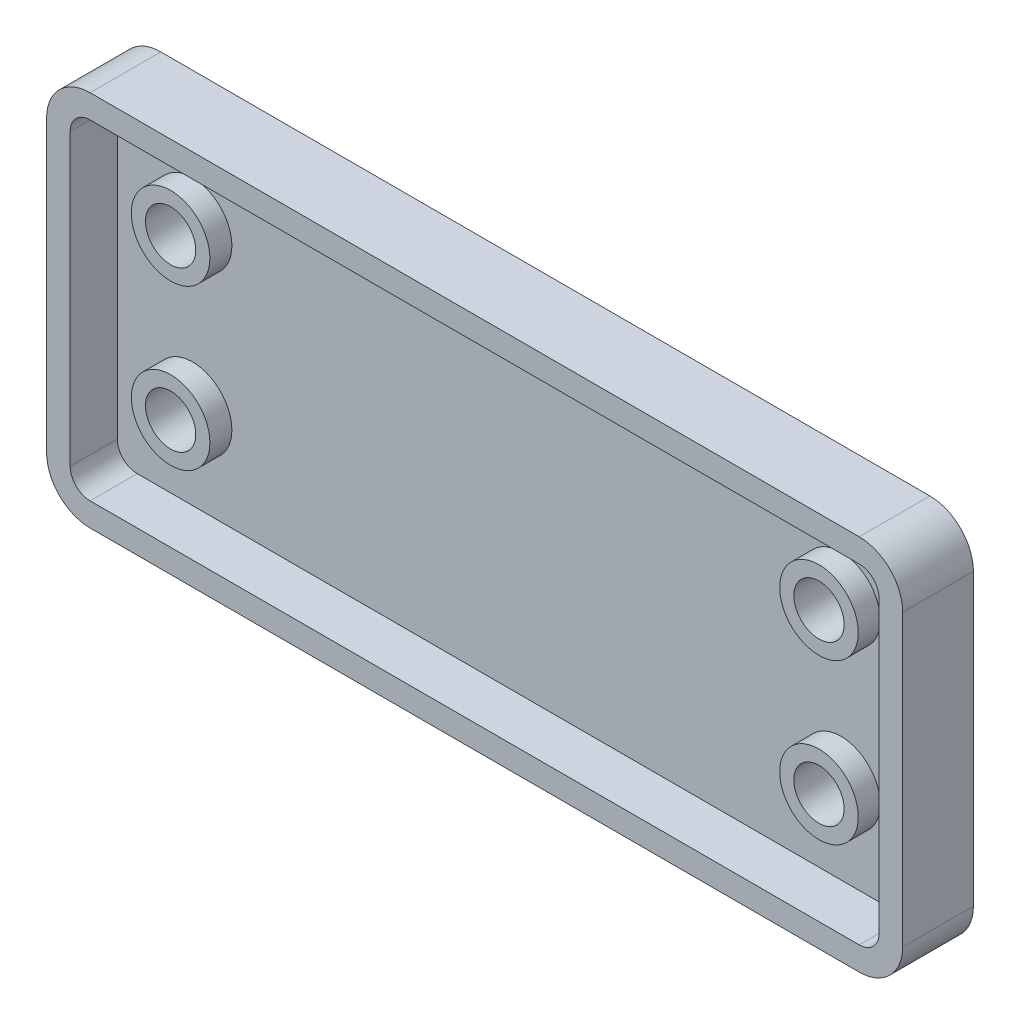
ISO-10303-21;
HEADER;
FILE_DESCRIPTION(('STEP AP214'),'2;1');
FILE_NAME('part.step','',(''),(''),'','','');
FILE_SCHEMA(('AUTOMOTIVE_DESIGN { 1 0 10303 214 1 1 1 1 }'));
ENDSEC;
DATA;
#1=APPLICATION_CONTEXT('core data for automotive mechanical design processes');
#2=APPLICATION_PROTOCOL_DEFINITION('international standard','automotive_design',2000,#1);
#3=PRODUCT_CONTEXT('',#1,'mechanical');
#4=PRODUCT('Part','Part','',(#3));
#5=PRODUCT_RELATED_PRODUCT_CATEGORY('part','',(#4));
#6=PRODUCT_DEFINITION_FORMATION('','',#4);
#7=PRODUCT_DEFINITION_CONTEXT('part definition',#1,'design');
#8=PRODUCT_DEFINITION('design','',#6,#7);
#9=PRODUCT_DEFINITION_SHAPE('','',#8);
#10=(LENGTH_UNIT() NAMED_UNIT(*) SI_UNIT(.MILLI.,.METRE.));
#11=(NAMED_UNIT(*) PLANE_ANGLE_UNIT() SI_UNIT($,.RADIAN.));
#12=(NAMED_UNIT(*) SI_UNIT($,.STERADIAN.) SOLID_ANGLE_UNIT());
#13=UNCERTAINTY_MEASURE_WITH_UNIT(LENGTH_MEASURE(1.E-05),#10,'distance_accuracy_value','');
#14=(GEOMETRIC_REPRESENTATION_CONTEXT(3) GLOBAL_UNCERTAINTY_ASSIGNED_CONTEXT((#13)) GLOBAL_UNIT_ASSIGNED_CONTEXT((#10,
#11,#12)) REPRESENTATION_CONTEXT('',''));
#15=CARTESIAN_POINT('',(0.,0.,0.));
#16=DIRECTION('',(0.,0.,1.));
#17=DIRECTION('',(1.,0.,0.));
#18=AXIS2_PLACEMENT_3D('',#15,#16,#17);
#19=CARTESIAN_POINT('',(24.48,-9.23,3.));
#20=DIRECTION('',(0.,0.,-1.));
#21=DIRECTION('',(-1.,0.,0.));
#22=AXIS2_PLACEMENT_3D('',#19,#20,#21);
#23=CYLINDRICAL_SURFACE('',#22,2.77);
#24=CARTESIAN_POINT('',(24.48,-9.23,-1.5));
#25=DIRECTION('',(0.,0.,1.));
#26=DIRECTION('',(1.,0.,0.));
#27=AXIS2_PLACEMENT_3D('',#24,#25,#26);
#28=CIRCLE('',#27,2.77);
#29=CARTESIAN_POINT('',(24.48,-12.,-1.5));
#30=VERTEX_POINT('',#29);
#31=CARTESIAN_POINT('',(27.25,-9.23,-1.5));
#32=VERTEX_POINT('',#31);
#33=EDGE_CURVE('E170',#30,#32,#28,.T.);
#34=ORIENTED_EDGE('',*,*,#33,.T.);
#35=DIRECTION('',(0.,0.,1.));
#36=VECTOR('',#35,1.);
#37=CARTESIAN_POINT('',(27.25,-9.23,3.));
#38=LINE('',#37,#36);
#39=CARTESIAN_POINT('',(27.25,-9.23,3.));
#40=VERTEX_POINT('',#39);
#41=EDGE_CURVE('E11',#40,#32,#38,.F.);
#42=ORIENTED_EDGE('',*,*,#41,.F.);
#43=CARTESIAN_POINT('',(24.48,-9.23,3.));
#44=DIRECTION('',(0.,0.,1.));
#45=DIRECTION('',(1.,0.,0.));
#46=AXIS2_PLACEMENT_3D('',#43,#44,#45);
#47=CIRCLE('',#46,2.77);
#48=CARTESIAN_POINT('',(24.48,-12.,3.));
#49=VERTEX_POINT('',#48);
#50=EDGE_CURVE('E257',#49,#40,#47,.T.);
#51=ORIENTED_EDGE('',*,*,#50,.F.);
#52=DIRECTION('',(0.,0.,-1.));
#53=VECTOR('',#52,1.);
#54=CARTESIAN_POINT('',(24.48,-12.,3.));
#55=LINE('',#54,#53);
#56=EDGE_CURVE('E224',#49,#30,#55,.T.);
#57=ORIENTED_EDGE('',*,*,#56,.T.);
#58=EDGE_LOOP('',(#34,#42,#51,#57));
#59=FACE_BOUND('',#58,.T.);
#60=ADVANCED_FACE('F34',(#59),#23,.T.);
#61=CARTESIAN_POINT('',(27.25,-9.23,3.));
#62=DIRECTION('',(-1.,0.,0.));
#63=DIRECTION('',(0.,-1.,0.));
#64=AXIS2_PLACEMENT_3D('',#61,#62,#63);
#65=PLANE('',#64);
#66=DIRECTION('',(0.,1.,0.));
#67=VECTOR('',#66,1.);
#68=CARTESIAN_POINT('',(27.25,-9.23,-1.5));
#69=LINE('',#68,#67);
#70=CARTESIAN_POINT('',(27.25,9.23,-1.5));
#71=VERTEX_POINT('',#70);
#72=EDGE_CURVE('E222',#32,#71,#69,.T.);
#73=ORIENTED_EDGE('',*,*,#72,.T.);
#74=DIRECTION('',(0.,0.,-1.));
#75=VECTOR('',#74,1.);
#76=CARTESIAN_POINT('',(27.25,9.23,3.));
#77=LINE('',#76,#75);
#78=CARTESIAN_POINT('',(27.25,9.23,3.));
#79=VERTEX_POINT('',#78);
#80=EDGE_CURVE('E43',#79,#71,#77,.T.);
#81=ORIENTED_EDGE('',*,*,#80,.F.);
#82=DIRECTION('',(0.,1.,0.));
#83=VECTOR('',#82,1.);
#84=CARTESIAN_POINT('',(27.25,-9.23,3.));
#85=LINE('',#84,#83);
#86=EDGE_CURVE('E259',#40,#79,#85,.T.);
#87=ORIENTED_EDGE('',*,*,#86,.F.);
#88=ORIENTED_EDGE('',*,*,#41,.T.);
#89=EDGE_LOOP('',(#73,#81,#87,#88));
#90=FACE_BOUND('',#89,.T.);
#91=ADVANCED_FACE('F287',(#90),#65,.F.);
#92=CARTESIAN_POINT('',(24.48,9.23,3.));
#93=DIRECTION('',(0.,0.,-1.));
#94=DIRECTION('',(-1.,0.,0.));
#95=AXIS2_PLACEMENT_3D('',#92,#93,#94);
#96=CYLINDRICAL_SURFACE('',#95,2.77);
#97=CARTESIAN_POINT('',(24.48,9.23,-1.5));
#98=DIRECTION('',(0.,0.,1.));
#99=DIRECTION('',(1.,0.,0.));
#100=AXIS2_PLACEMENT_3D('',#97,#98,#99);
#101=CIRCLE('',#100,2.77);
#102=CARTESIAN_POINT('',(24.48,12.,-1.5));
#103=VERTEX_POINT('',#102);
#104=EDGE_CURVE('E229',#71,#103,#101,.T.);
#105=ORIENTED_EDGE('',*,*,#104,.T.);
#106=DIRECTION('',(0.,0.,-1.));
#107=VECTOR('',#106,1.);
#108=CARTESIAN_POINT('',(24.48,12.,3.));
#109=LINE('',#108,#107);
#110=CARTESIAN_POINT('',(24.48,12.,3.));
#111=VERTEX_POINT('',#110);
#112=EDGE_CURVE('E232',#111,#103,#109,.T.);
#113=ORIENTED_EDGE('',*,*,#112,.F.);
#114=CARTESIAN_POINT('',(24.48,9.23,3.));
#115=DIRECTION('',(0.,0.,1.));
#116=DIRECTION('',(1.,0.,0.));
#117=AXIS2_PLACEMENT_3D('',#114,#115,#116);
#118=CIRCLE('',#117,2.77);
#119=EDGE_CURVE('E261',#79,#111,#118,.T.);
#120=ORIENTED_EDGE('',*,*,#119,.F.);
#121=ORIENTED_EDGE('',*,*,#80,.T.);
#122=EDGE_LOOP('',(#105,#113,#120,#121));
#123=FACE_BOUND('',#122,.T.);
#124=ADVANCED_FACE('F290',(#123),#96,.T.);
#125=CARTESIAN_POINT('',(-24.48,12.,3.));
#126=DIRECTION('',(0.,-1.,0.));
#127=DIRECTION('',(0.,0.,-1.));
#128=AXIS2_PLACEMENT_3D('',#125,#126,#127);
#129=PLANE('',#128);
#130=DIRECTION('',(-1.,0.,0.));
#131=VECTOR('',#130,1.);
#132=CARTESIAN_POINT('',(-24.48,12.,-1.5));
#133=LINE('',#132,#131);
#134=CARTESIAN_POINT('',(-24.48,12.,-1.5));
#135=VERTEX_POINT('',#134);
#136=EDGE_CURVE('E234',#103,#135,#133,.T.);
#137=ORIENTED_EDGE('',*,*,#136,.T.);
#138=DIRECTION('',(0.,0.,-1.));
#139=VECTOR('',#138,1.);
#140=CARTESIAN_POINT('',(-24.48,12.,3.));
#141=LINE('',#140,#139);
#142=CARTESIAN_POINT('',(-24.48,12.,3.));
#143=VERTEX_POINT('',#142);
#144=EDGE_CURVE('E237',#143,#135,#141,.T.);
#145=ORIENTED_EDGE('',*,*,#144,.F.);
#146=DIRECTION('',(-1.,0.,0.));
#147=VECTOR('',#146,1.);
#148=CARTESIAN_POINT('',(-24.48,12.,3.));
#149=LINE('',#148,#147);
#150=EDGE_CURVE('E263',#111,#143,#149,.T.);
#151=ORIENTED_EDGE('',*,*,#150,.F.);
#152=ORIENTED_EDGE('',*,*,#112,.T.);
#153=EDGE_LOOP('',(#137,#145,#151,#152));
#154=FACE_BOUND('',#153,.T.);
#155=ADVANCED_FACE('F295',(#154),#129,.F.);
#156=CARTESIAN_POINT('',(-24.48,9.23,3.));
#157=DIRECTION('',(0.,0.,-1.));
#158=DIRECTION('',(-1.,0.,0.));
#159=AXIS2_PLACEMENT_3D('',#156,#157,#158);
#160=CYLINDRICAL_SURFACE('',#159,2.77);
#161=CARTESIAN_POINT('',(-24.48,9.23,-1.5));
#162=DIRECTION('',(0.,0.,1.));
#163=DIRECTION('',(1.,0.,0.));
#164=AXIS2_PLACEMENT_3D('',#161,#162,#163);
#165=CIRCLE('',#164,2.77);
#166=CARTESIAN_POINT('',(-27.25,9.23,-1.5));
#167=VERTEX_POINT('',#166);
#168=EDGE_CURVE('E239',#135,#167,#165,.T.);
#169=ORIENTED_EDGE('',*,*,#168,.T.);
#170=DIRECTION('',(0.,0.,-1.));
#171=VECTOR('',#170,1.);
#172=CARTESIAN_POINT('',(-27.25,9.23,3.));
#173=LINE('',#172,#171);
#174=CARTESIAN_POINT('',(-27.25,9.23,3.));
#175=VERTEX_POINT('',#174);
#176=EDGE_CURVE('E242',#175,#167,#173,.T.);
#177=ORIENTED_EDGE('',*,*,#176,.F.);
#178=CARTESIAN_POINT('',(-24.48,9.23,3.));
#179=DIRECTION('',(0.,0.,1.));
#180=DIRECTION('',(1.,0.,0.));
#181=AXIS2_PLACEMENT_3D('',#178,#179,#180);
#182=CIRCLE('',#181,2.77);
#183=EDGE_CURVE('E265',#143,#175,#182,.T.);
#184=ORIENTED_EDGE('',*,*,#183,.F.);
#185=ORIENTED_EDGE('',*,*,#144,.T.);
#186=EDGE_LOOP('',(#169,#177,#184,#185));
#187=FACE_BOUND('',#186,.T.);
#188=ADVANCED_FACE('F299',(#187),#160,.T.);
#189=CARTESIAN_POINT('',(-27.25,-9.23,3.));
#190=DIRECTION('',(1.,0.,0.));
#191=DIRECTION('',(0.,0.,-1.));
#192=AXIS2_PLACEMENT_3D('',#189,#190,#191);
#193=PLANE('',#192);
#194=DIRECTION('',(0.,-1.,0.));
#195=VECTOR('',#194,1.);
#196=CARTESIAN_POINT('',(-27.25,-9.23,-1.5));
#197=LINE('',#196,#195);
#198=CARTESIAN_POINT('',(-27.25,-9.23,-1.5));
#199=VERTEX_POINT('',#198);
#200=EDGE_CURVE('E244',#167,#199,#197,.T.);
#201=ORIENTED_EDGE('',*,*,#200,.T.);
#202=DIRECTION('',(0.,0.,-1.));
#203=VECTOR('',#202,1.);
#204=CARTESIAN_POINT('',(-27.25,-9.23,3.));
#205=LINE('',#204,#203);
#206=CARTESIAN_POINT('',(-27.25,-9.23,3.));
#207=VERTEX_POINT('',#206);
#208=EDGE_CURVE('E247',#207,#199,#205,.T.);
#209=ORIENTED_EDGE('',*,*,#208,.F.);
#210=DIRECTION('',(0.,-1.,0.));
#211=VECTOR('',#210,1.);
#212=CARTESIAN_POINT('',(-27.25,-9.23,3.));
#213=LINE('',#212,#211);
#214=EDGE_CURVE('E267',#175,#207,#213,.T.);
#215=ORIENTED_EDGE('',*,*,#214,.F.);
#216=ORIENTED_EDGE('',*,*,#176,.T.);
#217=EDGE_LOOP('',(#201,#209,#215,#216));
#218=FACE_BOUND('',#217,.T.);
#219=ADVANCED_FACE('F303',(#218),#193,.F.);
#220=CARTESIAN_POINT('',(-24.48,-9.23,3.));
#221=DIRECTION('',(0.,0.,-1.));
#222=DIRECTION('',(-1.,0.,0.));
#223=AXIS2_PLACEMENT_3D('',#220,#221,#222);
#224=CYLINDRICAL_SURFACE('',#223,2.77);
#225=CARTESIAN_POINT('',(-24.48,-9.23,-1.5));
#226=DIRECTION('',(0.,0.,1.));
#227=DIRECTION('',(1.,0.,0.));
#228=AXIS2_PLACEMENT_3D('',#225,#226,#227);
#229=CIRCLE('',#228,2.77);
#230=CARTESIAN_POINT('',(-24.48,-12.,-1.5));
#231=VERTEX_POINT('',#230);
#232=EDGE_CURVE('E249',#199,#231,#229,.T.);
#233=ORIENTED_EDGE('',*,*,#232,.T.);
#234=DIRECTION('',(0.,0.,1.));
#235=VECTOR('',#234,1.);
#236=CARTESIAN_POINT('',(-24.48,-12.,3.));
#237=LINE('',#236,#235);
#238=CARTESIAN_POINT('',(-24.48,-12.,3.));
#239=VERTEX_POINT('',#238);
#240=EDGE_CURVE('E227',#239,#231,#237,.F.);
#241=ORIENTED_EDGE('',*,*,#240,.F.);
#242=CARTESIAN_POINT('',(-24.48,-9.23,3.));
#243=DIRECTION('',(0.,0.,1.));
#244=DIRECTION('',(1.,0.,0.));
#245=AXIS2_PLACEMENT_3D('',#242,#243,#244);
#246=CIRCLE('',#245,2.77);
#247=EDGE_CURVE('E268',#207,#239,#246,.T.);
#248=ORIENTED_EDGE('',*,*,#247,.F.);
#249=ORIENTED_EDGE('',*,*,#208,.T.);
#250=EDGE_LOOP('',(#233,#241,#248,#249));
#251=FACE_BOUND('',#250,.T.);
#252=ADVANCED_FACE('F274',(#251),#224,.T.);
#253=CARTESIAN_POINT('',(-24.48,-12.,3.));
#254=DIRECTION('',(0.,1.,0.));
#255=DIRECTION('',(0.,0.,1.));
#256=AXIS2_PLACEMENT_3D('',#253,#254,#255);
#257=PLANE('',#256);
#258=DIRECTION('',(1.,0.,0.));
#259=VECTOR('',#258,1.);
#260=CARTESIAN_POINT('',(-24.48,-12.,-1.5));
#261=LINE('',#260,#259);
#262=EDGE_CURVE('E253',#231,#30,#261,.T.);
#263=ORIENTED_EDGE('',*,*,#262,.T.);
#264=ORIENTED_EDGE('',*,*,#56,.F.);
#265=DIRECTION('',(1.,0.,0.));
#266=VECTOR('',#265,1.);
#267=CARTESIAN_POINT('',(-24.48,-12.,3.));
#268=LINE('',#267,#266);
#269=EDGE_CURVE('E38',#239,#49,#268,.T.);
#270=ORIENTED_EDGE('',*,*,#269,.F.);
#271=ORIENTED_EDGE('',*,*,#240,.T.);
#272=EDGE_LOOP('',(#263,#264,#270,#271));
#273=FACE_BOUND('',#272,.T.);
#274=ADVANCED_FACE('F278',(#273),#257,.F.);
#275=CARTESIAN_POINT('',(24.48,-9.23,3.));
#276=DIRECTION('',(0.,0.,1.));
#277=DIRECTION('',(1.,0.,0.));
#278=AXIS2_PLACEMENT_3D('',#275,#276,#277);
#279=PLANE('',#278);
#280=CARTESIAN_POINT('',(24.48,-9.23,3.));
#281=DIRECTION('',(0.,0.,1.));
#282=DIRECTION('',(1.,0.,0.));
#283=AXIS2_PLACEMENT_3D('',#280,#281,#282);
#284=CIRCLE('',#283,1.27);
#285=CARTESIAN_POINT('',(24.48,-10.5,3.));
#286=VERTEX_POINT('',#285);
#287=CARTESIAN_POINT('',(25.75,-9.23,3.));
#288=VERTEX_POINT('',#287);
#289=EDGE_CURVE('E151',#286,#288,#284,.T.);
#290=ORIENTED_EDGE('',*,*,#289,.F.);
#291=DIRECTION('',(1.,0.,0.));
#292=VECTOR('',#291,1.);
#293=CARTESIAN_POINT('',(-24.48,-10.5,3.));
#294=LINE('',#293,#292);
#295=CARTESIAN_POINT('',(-24.48,-10.5,3.));
#296=VERTEX_POINT('',#295);
#297=EDGE_CURVE('E189',#296,#286,#294,.T.);
#298=ORIENTED_EDGE('',*,*,#297,.F.);
#299=CARTESIAN_POINT('',(-24.48,-9.23,3.));
#300=DIRECTION('',(0.,0.,1.));
#301=DIRECTION('',(-1.,0.,0.));
#302=AXIS2_PLACEMENT_3D('',#299,#300,#301);
#303=CIRCLE('',#302,1.27);
#304=CARTESIAN_POINT('',(-25.75,-9.23,3.));
#305=VERTEX_POINT('',#304);
#306=EDGE_CURVE('E187',#305,#296,#303,.T.);
#307=ORIENTED_EDGE('',*,*,#306,.F.);
#308=DIRECTION('',(0.,-1.,0.));
#309=VECTOR('',#308,1.);
#310=CARTESIAN_POINT('',(-25.75,-9.23,3.));
#311=LINE('',#310,#309);
#312=CARTESIAN_POINT('',(-25.75,9.23,3.));
#313=VERTEX_POINT('',#312);
#314=EDGE_CURVE('E185',#313,#305,#311,.T.);
#315=ORIENTED_EDGE('',*,*,#314,.F.);
#316=CARTESIAN_POINT('',(-24.48,9.23,3.));
#317=DIRECTION('',(0.,0.,1.));
#318=DIRECTION('',(-1.,0.,0.));
#319=AXIS2_PLACEMENT_3D('',#316,#317,#318);
#320=CIRCLE('',#319,1.27);
#321=CARTESIAN_POINT('',(-24.48,10.5,3.));
#322=VERTEX_POINT('',#321);
#323=EDGE_CURVE('E183',#322,#313,#320,.T.);
#324=ORIENTED_EDGE('',*,*,#323,.F.);
#325=DIRECTION('',(-1.,0.,0.));
#326=VECTOR('',#325,1.);
#327=CARTESIAN_POINT('',(-24.48,10.5,3.));
#328=LINE('',#327,#326);
#329=CARTESIAN_POINT('',(24.48,10.5,3.));
#330=VERTEX_POINT('',#329);
#331=EDGE_CURVE('E178',#330,#322,#328,.T.);
#332=ORIENTED_EDGE('',*,*,#331,.F.);
#333=CARTESIAN_POINT('',(24.48,9.23,3.));
#334=DIRECTION('',(0.,0.,1.));
#335=DIRECTION('',(-1.,0.,0.));
#336=AXIS2_PLACEMENT_3D('',#333,#334,#335);
#337=CIRCLE('',#336,1.27);
#338=CARTESIAN_POINT('',(25.75,9.23,3.));
#339=VERTEX_POINT('',#338);
#340=EDGE_CURVE('E176',#339,#330,#337,.T.);
#341=ORIENTED_EDGE('',*,*,#340,.F.);
#342=DIRECTION('',(0.,1.,0.));
#343=VECTOR('',#342,1.);
#344=CARTESIAN_POINT('',(25.75,-9.23,3.));
#345=LINE('',#344,#343);
#346=EDGE_CURVE('E162',#288,#339,#345,.T.);
#347=ORIENTED_EDGE('',*,*,#346,.F.);
#348=EDGE_LOOP('',(#290,#298,#307,#315,#324,#332,#341,#347));
#349=FACE_BOUND('',#348,.T.);
#350=ORIENTED_EDGE('',*,*,#50,.T.);
#351=ORIENTED_EDGE('',*,*,#86,.T.);
#352=ORIENTED_EDGE('',*,*,#119,.T.);
#353=ORIENTED_EDGE('',*,*,#150,.T.);
#354=ORIENTED_EDGE('',*,*,#183,.T.);
#355=ORIENTED_EDGE('',*,*,#214,.T.);
#356=ORIENTED_EDGE('',*,*,#247,.T.);
#357=ORIENTED_EDGE('',*,*,#269,.T.);
#358=EDGE_LOOP('',(#350,#351,#352,#353,#354,#355,#356,#357));
#359=FACE_BOUND('',#358,.T.);
#360=ADVANCED_FACE('F174',(#349,#359),#279,.T.);
#361=CARTESIAN_POINT('',(24.48,-9.23,-1.5));
#362=DIRECTION('',(0.,0.,1.));
#363=DIRECTION('',(1.,0.,0.));
#364=AXIS2_PLACEMENT_3D('',#361,#362,#363);
#365=PLANE('',#364);
#366=CARTESIAN_POINT('',(20.32,-5.08,-1.5));
#367=DIRECTION('',(0.,0.,1.));
#368=DIRECTION('',(1.,0.,0.));
#369=AXIS2_PLACEMENT_3D('',#366,#367,#368);
#370=CIRCLE('',#369,1.6);
#371=CARTESIAN_POINT('',(21.92,-5.08,-1.5));
#372=VERTEX_POINT('',#371);
#373=EDGE_CURVE('E573',#372,#372,#370,.T.);
#374=ORIENTED_EDGE('',*,*,#373,.T.);
#375=EDGE_LOOP('',(#374));
#376=FACE_BOUND('',#375,.T.);
#377=CARTESIAN_POINT('',(-20.955,-5.08,-1.5));
#378=DIRECTION('',(0.,0.,1.));
#379=DIRECTION('',(1.,0.,0.));
#380=AXIS2_PLACEMENT_3D('',#377,#378,#379);
#381=CIRCLE('',#380,1.60000000000001);
#382=CARTESIAN_POINT('',(-19.355,-5.08,-1.5));
#383=VERTEX_POINT('',#382);
#384=EDGE_CURVE('E568',#383,#383,#381,.T.);
#385=ORIENTED_EDGE('',*,*,#384,.T.);
#386=EDGE_LOOP('',(#385));
#387=FACE_BOUND('',#386,.T.);
#388=CARTESIAN_POINT('',(-20.955,5.08,-1.5));
#389=DIRECTION('',(0.,0.,1.));
#390=DIRECTION('',(1.,0.,0.));
#391=AXIS2_PLACEMENT_3D('',#388,#389,#390);
#392=CIRCLE('',#391,1.60000000000001);
#393=CARTESIAN_POINT('',(-19.355,5.08,-1.5));
#394=VERTEX_POINT('',#393);
#395=EDGE_CURVE('E565',#394,#394,#392,.T.);
#396=ORIENTED_EDGE('',*,*,#395,.T.);
#397=EDGE_LOOP('',(#396));
#398=FACE_BOUND('',#397,.T.);
#399=CARTESIAN_POINT('',(20.32,5.08,-1.5));
#400=DIRECTION('',(0.,0.,1.));
#401=DIRECTION('',(1.,0.,0.));
#402=AXIS2_PLACEMENT_3D('',#399,#400,#401);
#403=CIRCLE('',#402,1.6);
#404=CARTESIAN_POINT('',(21.92,5.08,-1.5));
#405=VERTEX_POINT('',#404);
#406=EDGE_CURVE('E567',#405,#405,#403,.T.);
#407=ORIENTED_EDGE('',*,*,#406,.T.);
#408=EDGE_LOOP('',(#407));
#409=FACE_BOUND('',#408,.T.);
#410=ORIENTED_EDGE('',*,*,#33,.F.);
#411=ORIENTED_EDGE('',*,*,#262,.F.);
#412=ORIENTED_EDGE('',*,*,#232,.F.);
#413=ORIENTED_EDGE('',*,*,#200,.F.);
#414=ORIENTED_EDGE('',*,*,#168,.F.);
#415=ORIENTED_EDGE('',*,*,#136,.F.);
#416=ORIENTED_EDGE('',*,*,#104,.F.);
#417=ORIENTED_EDGE('',*,*,#72,.F.);
#418=EDGE_LOOP('',(#410,#411,#412,#413,#414,#415,#416,#417));
#419=FACE_BOUND('',#418,.T.);
#420=ADVANCED_FACE('F36',(#376,#387,#398,#409,#419),#365,.F.);
#421=CARTESIAN_POINT('',(24.48,-9.23,3.));
#422=DIRECTION('',(0.,0.,-1.));
#423=DIRECTION('',(-1.,0.,0.));
#424=AXIS2_PLACEMENT_3D('',#421,#422,#423);
#425=CYLINDRICAL_SURFACE('',#424,1.27);
#426=CARTESIAN_POINT('',(24.48,-9.23,0.));
#427=DIRECTION('',(0.,0.,1.));
#428=DIRECTION('',(1.,0.,0.));
#429=AXIS2_PLACEMENT_3D('',#426,#427,#428);
#430=CIRCLE('',#429,1.27);
#431=CARTESIAN_POINT('',(24.48,-10.5,0.));
#432=VERTEX_POINT('',#431);
#433=CARTESIAN_POINT('',(25.75,-9.23,0.));
#434=VERTEX_POINT('',#433);
#435=EDGE_CURVE('E191',#432,#434,#430,.T.);
#436=ORIENTED_EDGE('',*,*,#435,.F.);
#437=DIRECTION('',(0.,0.,-1.));
#438=VECTOR('',#437,1.);
#439=CARTESIAN_POINT('',(24.48,-10.5,3.));
#440=LINE('',#439,#438);
#441=EDGE_CURVE('E158',#286,#432,#440,.T.);
#442=ORIENTED_EDGE('',*,*,#441,.F.);
#443=ORIENTED_EDGE('',*,*,#289,.T.);
#444=DIRECTION('',(0.,0.,-1.));
#445=VECTOR('',#444,1.);
#446=CARTESIAN_POINT('',(25.75,-9.23,3.));
#447=LINE('',#446,#445);
#448=EDGE_CURVE('E155',#288,#434,#447,.T.);
#449=ORIENTED_EDGE('',*,*,#448,.T.);
#450=EDGE_LOOP('',(#436,#442,#443,#449));
#451=FACE_BOUND('',#450,.T.);
#452=ADVANCED_FACE('F154',(#451),#425,.F.);
#453=CARTESIAN_POINT('',(25.75,-9.23,3.));
#454=DIRECTION('',(-1.,0.,0.));
#455=DIRECTION('',(0.,-1.,0.));
#456=AXIS2_PLACEMENT_3D('',#453,#454,#455);
#457=PLANE('',#456);
#458=DIRECTION('',(0.,1.,0.));
#459=VECTOR('',#458,1.);
#460=CARTESIAN_POINT('',(25.75,-9.23,0.));
#461=LINE('',#460,#459);
#462=CARTESIAN_POINT('',(25.75,9.23,0.));
#463=VERTEX_POINT('',#462);
#464=EDGE_CURVE('E169',#434,#463,#461,.T.);
#465=ORIENTED_EDGE('',*,*,#464,.F.);
#466=ORIENTED_EDGE('',*,*,#448,.F.);
#467=ORIENTED_EDGE('',*,*,#346,.T.);
#468=DIRECTION('',(0.,0.,-1.));
#469=VECTOR('',#468,1.);
#470=CARTESIAN_POINT('',(25.75,9.23,3.));
#471=LINE('',#470,#469);
#472=EDGE_CURVE('E171',#339,#463,#471,.T.);
#473=ORIENTED_EDGE('',*,*,#472,.T.);
#474=EDGE_LOOP('',(#465,#466,#467,#473));
#475=FACE_BOUND('',#474,.T.);
#476=ADVANCED_FACE('F166',(#475),#457,.T.);
#477=CARTESIAN_POINT('',(24.48,9.23,3.));
#478=DIRECTION('',(0.,0.,-1.));
#479=DIRECTION('',(-1.,0.,0.));
#480=AXIS2_PLACEMENT_3D('',#477,#478,#479);
#481=CYLINDRICAL_SURFACE('',#480,1.27);
#482=CARTESIAN_POINT('',(24.48,9.23,0.));
#483=DIRECTION('',(0.,0.,1.));
#484=DIRECTION('',(-1.,0.,0.));
#485=AXIS2_PLACEMENT_3D('',#482,#483,#484);
#486=CIRCLE('',#485,1.27);
#487=CARTESIAN_POINT('',(24.48,10.5,0.));
#488=VERTEX_POINT('',#487);
#489=EDGE_CURVE('E195',#463,#488,#486,.T.);
#490=ORIENTED_EDGE('',*,*,#489,.F.);
#491=ORIENTED_EDGE('',*,*,#472,.F.);
#492=ORIENTED_EDGE('',*,*,#340,.T.);
#493=DIRECTION('',(0.,0.,-1.));
#494=VECTOR('',#493,1.);
#495=CARTESIAN_POINT('',(24.48,10.5,3.));
#496=LINE('',#495,#494);
#497=EDGE_CURVE('E217',#330,#488,#496,.T.);
#498=ORIENTED_EDGE('',*,*,#497,.T.);
#499=EDGE_LOOP('',(#490,#491,#492,#498));
#500=FACE_BOUND('',#499,.T.);
#501=ADVANCED_FACE('F355',(#500),#481,.F.);
#502=CARTESIAN_POINT('',(-24.48,10.5,3.));
#503=DIRECTION('',(0.,-1.,0.));
#504=DIRECTION('',(0.,0.,-1.));
#505=AXIS2_PLACEMENT_3D('',#502,#503,#504);
#506=PLANE('',#505);
#507=DIRECTION('',(-1.,0.,0.));
#508=VECTOR('',#507,1.);
#509=CARTESIAN_POINT('',(-24.48,10.5,0.));
#510=LINE('',#509,#508);
#511=CARTESIAN_POINT('',(-24.48,10.5,0.));
#512=VERTEX_POINT('',#511);
#513=EDGE_CURVE('E197',#488,#512,#510,.T.);
#514=ORIENTED_EDGE('',*,*,#513,.F.);
#515=ORIENTED_EDGE('',*,*,#497,.F.);
#516=ORIENTED_EDGE('',*,*,#331,.T.);
#517=DIRECTION('',(0.,0.,-1.));
#518=VECTOR('',#517,1.);
#519=CARTESIAN_POINT('',(-24.48,10.5,3.));
#520=LINE('',#519,#518);
#521=EDGE_CURVE('E214',#322,#512,#520,.T.);
#522=ORIENTED_EDGE('',*,*,#521,.T.);
#523=EDGE_LOOP('',(#514,#515,#516,#522));
#524=FACE_BOUND('',#523,.T.);
#525=ADVANCED_FACE('F364',(#524),#506,.T.);
#526=CARTESIAN_POINT('',(-24.48,9.23,3.));
#527=DIRECTION('',(0.,0.,-1.));
#528=DIRECTION('',(-1.,0.,0.));
#529=AXIS2_PLACEMENT_3D('',#526,#527,#528);
#530=CYLINDRICAL_SURFACE('',#529,1.27);
#531=CARTESIAN_POINT('',(-24.48,9.23,0.));
#532=DIRECTION('',(0.,0.,1.));
#533=DIRECTION('',(-1.,0.,0.));
#534=AXIS2_PLACEMENT_3D('',#531,#532,#533);
#535=CIRCLE('',#534,1.27);
#536=CARTESIAN_POINT('',(-25.75,9.23,0.));
#537=VERTEX_POINT('',#536);
#538=EDGE_CURVE('E199',#512,#537,#535,.T.);
#539=ORIENTED_EDGE('',*,*,#538,.F.);
#540=ORIENTED_EDGE('',*,*,#521,.F.);
#541=ORIENTED_EDGE('',*,*,#323,.T.);
#542=DIRECTION('',(0.,0.,-1.));
#543=VECTOR('',#542,1.);
#544=CARTESIAN_POINT('',(-25.75,9.23,3.));
#545=LINE('',#544,#543);
#546=EDGE_CURVE('E211',#313,#537,#545,.T.);
#547=ORIENTED_EDGE('',*,*,#546,.T.);
#548=EDGE_LOOP('',(#539,#540,#541,#547));
#549=FACE_BOUND('',#548,.T.);
#550=ADVANCED_FACE('F374',(#549),#530,.F.);
#551=CARTESIAN_POINT('',(-25.75,-9.23,3.));
#552=DIRECTION('',(1.,0.,0.));
#553=DIRECTION('',(0.,0.,-1.));
#554=AXIS2_PLACEMENT_3D('',#551,#552,#553);
#555=PLANE('',#554);
#556=DIRECTION('',(0.,-1.,0.));
#557=VECTOR('',#556,1.);
#558=CARTESIAN_POINT('',(-25.75,-9.23,0.));
#559=LINE('',#558,#557);
#560=CARTESIAN_POINT('',(-25.75,-9.23,0.));
#561=VERTEX_POINT('',#560);
#562=EDGE_CURVE('E201',#537,#561,#559,.T.);
#563=ORIENTED_EDGE('',*,*,#562,.F.);
#564=ORIENTED_EDGE('',*,*,#546,.F.);
#565=ORIENTED_EDGE('',*,*,#314,.T.);
#566=DIRECTION('',(0.,0.,-1.));
#567=VECTOR('',#566,1.);
#568=CARTESIAN_POINT('',(-25.75,-9.23,3.));
#569=LINE('',#568,#567);
#570=EDGE_CURVE('E208',#305,#561,#569,.T.);
#571=ORIENTED_EDGE('',*,*,#570,.T.);
#572=EDGE_LOOP('',(#563,#564,#565,#571));
#573=FACE_BOUND('',#572,.T.);
#574=ADVANCED_FACE('F384',(#573),#555,.T.);
#575=CARTESIAN_POINT('',(-24.48,-9.23,3.));
#576=DIRECTION('',(0.,0.,-1.));
#577=DIRECTION('',(-1.,0.,0.));
#578=AXIS2_PLACEMENT_3D('',#575,#576,#577);
#579=CYLINDRICAL_SURFACE('',#578,1.27);
#580=CARTESIAN_POINT('',(-24.48,-9.23,0.));
#581=DIRECTION('',(0.,0.,1.));
#582=DIRECTION('',(-1.,0.,0.));
#583=AXIS2_PLACEMENT_3D('',#580,#581,#582);
#584=CIRCLE('',#583,1.27);
#585=CARTESIAN_POINT('',(-24.48,-10.5,0.));
#586=VERTEX_POINT('',#585);
#587=EDGE_CURVE('E203',#561,#586,#584,.T.);
#588=ORIENTED_EDGE('',*,*,#587,.F.);
#589=ORIENTED_EDGE('',*,*,#570,.F.);
#590=ORIENTED_EDGE('',*,*,#306,.T.);
#591=DIRECTION('',(0.,0.,-1.));
#592=VECTOR('',#591,1.);
#593=CARTESIAN_POINT('',(-24.48,-10.5,3.));
#594=LINE('',#593,#592);
#595=EDGE_CURVE('E51',#296,#586,#594,.T.);
#596=ORIENTED_EDGE('',*,*,#595,.T.);
#597=EDGE_LOOP('',(#588,#589,#590,#596));
#598=FACE_BOUND('',#597,.T.);
#599=ADVANCED_FACE('F394',(#598),#579,.F.);
#600=CARTESIAN_POINT('',(-24.48,-10.5,3.));
#601=DIRECTION('',(0.,1.,0.));
#602=DIRECTION('',(0.,0.,1.));
#603=AXIS2_PLACEMENT_3D('',#600,#601,#602);
#604=PLANE('',#603);
#605=DIRECTION('',(1.,0.,0.));
#606=VECTOR('',#605,1.);
#607=CARTESIAN_POINT('',(-24.48,-10.5,0.));
#608=LINE('',#607,#606);
#609=EDGE_CURVE('E163',#586,#432,#608,.T.);
#610=ORIENTED_EDGE('',*,*,#609,.F.);
#611=ORIENTED_EDGE('',*,*,#595,.F.);
#612=ORIENTED_EDGE('',*,*,#297,.T.);
#613=ORIENTED_EDGE('',*,*,#441,.T.);
#614=EDGE_LOOP('',(#610,#611,#612,#613));
#615=FACE_BOUND('',#614,.T.);
#616=ADVANCED_FACE('F404',(#615),#604,.T.);
#617=CARTESIAN_POINT('',(24.48,-9.23,0.));
#618=DIRECTION('',(0.,0.,1.));
#619=DIRECTION('',(1.,0.,0.));
#620=AXIS2_PLACEMENT_3D('',#617,#618,#619);
#621=PLANE('',#620);
#622=CARTESIAN_POINT('',(-20.955,5.08,0.));
#623=DIRECTION('',(0.,0.,1.));
#624=DIRECTION('',(1.,0.,0.));
#625=AXIS2_PLACEMENT_3D('',#622,#623,#624);
#626=CIRCLE('',#625,2.5);
#627=CARTESIAN_POINT('',(-18.455,5.08,0.));
#628=VERTEX_POINT('',#627);
#629=EDGE_CURVE('E578',#628,#628,#626,.T.);
#630=ORIENTED_EDGE('',*,*,#629,.F.);
#631=EDGE_LOOP('',(#630));
#632=FACE_BOUND('',#631,.T.);
#633=CARTESIAN_POINT('',(-20.955,-5.08,0.));
#634=DIRECTION('',(0.,0.,1.));
#635=DIRECTION('',(1.,0.,0.));
#636=AXIS2_PLACEMENT_3D('',#633,#634,#635);
#637=CIRCLE('',#636,2.5);
#638=CARTESIAN_POINT('',(-18.455,-5.08,0.));
#639=VERTEX_POINT('',#638);
#640=EDGE_CURVE('E587',#639,#639,#637,.T.);
#641=ORIENTED_EDGE('',*,*,#640,.F.);
#642=EDGE_LOOP('',(#641));
#643=FACE_BOUND('',#642,.T.);
#644=CARTESIAN_POINT('',(20.32,5.08,0.));
#645=DIRECTION('',(0.,0.,1.));
#646=DIRECTION('',(1.,0.,0.));
#647=AXIS2_PLACEMENT_3D('',#644,#645,#646);
#648=CIRCLE('',#647,2.5);
#649=CARTESIAN_POINT('',(22.82,5.08,0.));
#650=VERTEX_POINT('',#649);
#651=EDGE_CURVE('E596',#650,#650,#648,.T.);
#652=ORIENTED_EDGE('',*,*,#651,.F.);
#653=EDGE_LOOP('',(#652));
#654=FACE_BOUND('',#653,.T.);
#655=CARTESIAN_POINT('',(20.32,-5.08,0.));
#656=DIRECTION('',(0.,0.,1.));
#657=DIRECTION('',(1.,0.,0.));
#658=AXIS2_PLACEMENT_3D('',#655,#656,#657);
#659=CIRCLE('',#658,2.5);
#660=CARTESIAN_POINT('',(22.82,-5.08,0.));
#661=VERTEX_POINT('',#660);
#662=EDGE_CURVE('E605',#661,#661,#659,.T.);
#663=ORIENTED_EDGE('',*,*,#662,.F.);
#664=EDGE_LOOP('',(#663));
#665=FACE_BOUND('',#664,.T.);
#666=ORIENTED_EDGE('',*,*,#435,.T.);
#667=ORIENTED_EDGE('',*,*,#464,.T.);
#668=ORIENTED_EDGE('',*,*,#489,.T.);
#669=ORIENTED_EDGE('',*,*,#513,.T.);
#670=ORIENTED_EDGE('',*,*,#538,.T.);
#671=ORIENTED_EDGE('',*,*,#562,.T.);
#672=ORIENTED_EDGE('',*,*,#587,.T.);
#673=ORIENTED_EDGE('',*,*,#609,.T.);
#674=EDGE_LOOP('',(#666,#667,#668,#669,#670,#671,#672,#673));
#675=FACE_BOUND('',#674,.T.);
#676=ADVANCED_FACE('F414',(#632,#643,#654,#665,#675),#621,.T.);
#677=CARTESIAN_POINT('',(20.32,-5.08,1.4));
#678=DIRECTION('',(0.,0.,1.));
#679=DIRECTION('',(1.,0.,0.));
#680=AXIS2_PLACEMENT_3D('',#677,#678,#679);
#681=PLANE('',#680);
#682=CARTESIAN_POINT('',(20.32,-5.08,1.4));
#683=DIRECTION('',(0.,0.,1.));
#684=DIRECTION('',(1.,0.,0.));
#685=AXIS2_PLACEMENT_3D('',#682,#683,#684);
#686=CIRCLE('',#685,2.5);
#687=CARTESIAN_POINT('',(22.82,-5.08,1.4));
#688=VERTEX_POINT('',#687);
#689=EDGE_CURVE('E193',#688,#688,#686,.T.);
#690=ORIENTED_EDGE('',*,*,#689,.T.);
#691=EDGE_LOOP('',(#690));
#692=FACE_BOUND('',#691,.T.);
#693=CARTESIAN_POINT('',(20.32,-5.08,1.4));
#694=DIRECTION('',(0.,0.,1.));
#695=DIRECTION('',(1.,0.,0.));
#696=AXIS2_PLACEMENT_3D('',#693,#694,#695);
#697=CIRCLE('',#696,1.6);
#698=CARTESIAN_POINT('',(21.92,-5.08,1.4));
#699=VERTEX_POINT('',#698);
#700=EDGE_CURVE('E600',#699,#699,#697,.T.);
#701=ORIENTED_EDGE('',*,*,#700,.F.);
#702=EDGE_LOOP('',(#701));
#703=FACE_BOUND('',#702,.T.);
#704=ADVANCED_FACE('F424',(#692,#703),#681,.T.);
#705=CARTESIAN_POINT('',(20.32,-5.08,1.4));
#706=DIRECTION('',(0.,0.,-1.));
#707=DIRECTION('',(-1.,0.,0.));
#708=AXIS2_PLACEMENT_3D('',#705,#706,#707);
#709=CYLINDRICAL_SURFACE('',#708,2.5);
#710=ORIENTED_EDGE('',*,*,#689,.F.);
#711=EDGE_LOOP('',(#710));
#712=FACE_BOUND('',#711,.T.);
#713=ORIENTED_EDGE('',*,*,#662,.T.);
#714=EDGE_LOOP('',(#713));
#715=FACE_BOUND('',#714,.T.);
#716=ADVANCED_FACE('F434',(#712,#715),#709,.T.);
#717=CARTESIAN_POINT('',(20.32,-5.08,1.4));
#718=DIRECTION('',(0.,0.,-1.));
#719=DIRECTION('',(-1.,0.,0.));
#720=AXIS2_PLACEMENT_3D('',#717,#718,#719);
#721=CYLINDRICAL_SURFACE('',#720,1.6);
#722=ORIENTED_EDGE('',*,*,#700,.T.);
#723=EDGE_LOOP('',(#722));
#724=FACE_BOUND('',#723,.T.);
#725=ORIENTED_EDGE('',*,*,#373,.F.);
#726=EDGE_LOOP('',(#725));
#727=FACE_BOUND('',#726,.T.);
#728=ADVANCED_FACE('F445',(#724,#727),#721,.F.);
#729=CARTESIAN_POINT('',(20.32,5.08,1.4));
#730=DIRECTION('',(0.,0.,1.));
#731=DIRECTION('',(1.,0.,0.));
#732=AXIS2_PLACEMENT_3D('',#729,#730,#731);
#733=PLANE('',#732);
#734=CARTESIAN_POINT('',(20.32,5.08,1.4));
#735=DIRECTION('',(0.,0.,1.));
#736=DIRECTION('',(1.,0.,0.));
#737=AXIS2_PLACEMENT_3D('',#734,#735,#736);
#738=CIRCLE('',#737,2.5);
#739=CARTESIAN_POINT('',(22.82,5.08,1.4));
#740=VERTEX_POINT('',#739);
#741=EDGE_CURVE('E597',#740,#740,#738,.T.);
#742=ORIENTED_EDGE('',*,*,#741,.T.);
#743=EDGE_LOOP('',(#742));
#744=FACE_BOUND('',#743,.T.);
#745=CARTESIAN_POINT('',(20.32,5.08,1.4));
#746=DIRECTION('',(0.,0.,1.));
#747=DIRECTION('',(1.,0.,0.));
#748=AXIS2_PLACEMENT_3D('',#745,#746,#747);
#749=CIRCLE('',#748,1.6);
#750=CARTESIAN_POINT('',(21.92,5.08,1.4));
#751=VERTEX_POINT('',#750);
#752=EDGE_CURVE('E591',#751,#751,#749,.T.);
#753=ORIENTED_EDGE('',*,*,#752,.F.);
#754=EDGE_LOOP('',(#753));
#755=FACE_BOUND('',#754,.T.);
#756=ADVANCED_FACE('F453',(#744,#755),#733,.T.);
#757=CARTESIAN_POINT('',(20.32,5.08,1.4));
#758=DIRECTION('',(0.,0.,-1.));
#759=DIRECTION('',(-1.,0.,0.));
#760=AXIS2_PLACEMENT_3D('',#757,#758,#759);
#761=CYLINDRICAL_SURFACE('',#760,2.5);
#762=ORIENTED_EDGE('',*,*,#741,.F.);
#763=EDGE_LOOP('',(#762));
#764=FACE_BOUND('',#763,.T.);
#765=ORIENTED_EDGE('',*,*,#651,.T.);
#766=EDGE_LOOP('',(#765));
#767=FACE_BOUND('',#766,.T.);
#768=ADVANCED_FACE('F458',(#764,#767),#761,.T.);
#769=CARTESIAN_POINT('',(20.32,5.08,1.4));
#770=DIRECTION('',(0.,0.,-1.));
#771=DIRECTION('',(-1.,0.,0.));
#772=AXIS2_PLACEMENT_3D('',#769,#770,#771);
#773=CYLINDRICAL_SURFACE('',#772,1.6);
#774=ORIENTED_EDGE('',*,*,#752,.T.);
#775=EDGE_LOOP('',(#774));
#776=FACE_BOUND('',#775,.T.);
#777=ORIENTED_EDGE('',*,*,#406,.F.);
#778=EDGE_LOOP('',(#777));
#779=FACE_BOUND('',#778,.T.);
#780=ADVANCED_FACE('F468',(#776,#779),#773,.F.);
#781=CARTESIAN_POINT('',(-20.955,-5.08,1.4));
#782=DIRECTION('',(0.,0.,1.));
#783=DIRECTION('',(1.,0.,0.));
#784=AXIS2_PLACEMENT_3D('',#781,#782,#783);
#785=PLANE('',#784);
#786=CARTESIAN_POINT('',(-20.955,-5.08,1.4));
#787=DIRECTION('',(0.,0.,1.));
#788=DIRECTION('',(1.,0.,0.));
#789=AXIS2_PLACEMENT_3D('',#786,#787,#788);
#790=CIRCLE('',#789,2.5);
#791=CARTESIAN_POINT('',(-18.455,-5.08,1.4));
#792=VERTEX_POINT('',#791);
#793=EDGE_CURVE('E588',#792,#792,#790,.T.);
#794=ORIENTED_EDGE('',*,*,#793,.T.);
#795=EDGE_LOOP('',(#794));
#796=FACE_BOUND('',#795,.T.);
#797=CARTESIAN_POINT('',(-20.955,-5.08,1.4));
#798=DIRECTION('',(0.,0.,1.));
#799=DIRECTION('',(1.,0.,0.));
#800=AXIS2_PLACEMENT_3D('',#797,#798,#799);
#801=CIRCLE('',#800,1.60000000000001);
#802=CARTESIAN_POINT('',(-19.355,-5.08,1.4));
#803=VERTEX_POINT('',#802);
#804=EDGE_CURVE('E582',#803,#803,#801,.T.);
#805=ORIENTED_EDGE('',*,*,#804,.F.);
#806=EDGE_LOOP('',(#805));
#807=FACE_BOUND('',#806,.T.);
#808=ADVANCED_FACE('F476',(#796,#807),#785,.T.);
#809=CARTESIAN_POINT('',(-20.955,-5.08,1.4));
#810=DIRECTION('',(0.,0.,-1.));
#811=DIRECTION('',(-1.,0.,0.));
#812=AXIS2_PLACEMENT_3D('',#809,#810,#811);
#813=CYLINDRICAL_SURFACE('',#812,2.5);
#814=ORIENTED_EDGE('',*,*,#793,.F.);
#815=EDGE_LOOP('',(#814));
#816=FACE_BOUND('',#815,.T.);
#817=ORIENTED_EDGE('',*,*,#640,.T.);
#818=EDGE_LOOP('',(#817));
#819=FACE_BOUND('',#818,.T.);
#820=ADVANCED_FACE('F481',(#816,#819),#813,.T.);
#821=CARTESIAN_POINT('',(-20.955,-5.08,1.4));
#822=DIRECTION('',(0.,0.,-1.));
#823=DIRECTION('',(-1.,0.,0.));
#824=AXIS2_PLACEMENT_3D('',#821,#822,#823);
#825=CYLINDRICAL_SURFACE('',#824,1.60000000000001);
#826=ORIENTED_EDGE('',*,*,#804,.T.);
#827=EDGE_LOOP('',(#826));
#828=FACE_BOUND('',#827,.T.);
#829=ORIENTED_EDGE('',*,*,#384,.F.);
#830=EDGE_LOOP('',(#829));
#831=FACE_BOUND('',#830,.T.);
#832=ADVANCED_FACE('F491',(#828,#831),#825,.F.);
#833=CARTESIAN_POINT('',(-20.955,5.08,1.4));
#834=DIRECTION('',(0.,0.,1.));
#835=DIRECTION('',(1.,0.,0.));
#836=AXIS2_PLACEMENT_3D('',#833,#834,#835);
#837=PLANE('',#836);
#838=CARTESIAN_POINT('',(-20.955,5.08,1.4));
#839=DIRECTION('',(0.,0.,1.));
#840=DIRECTION('',(1.,0.,0.));
#841=AXIS2_PLACEMENT_3D('',#838,#839,#840);
#842=CIRCLE('',#841,2.5);
#843=CARTESIAN_POINT('',(-18.455,5.08,1.4));
#844=VERTEX_POINT('',#843);
#845=EDGE_CURVE('E579',#844,#844,#842,.T.);
#846=ORIENTED_EDGE('',*,*,#845,.T.);
#847=EDGE_LOOP('',(#846));
#848=FACE_BOUND('',#847,.T.);
#849=CARTESIAN_POINT('',(-20.955,5.08,1.4));
#850=DIRECTION('',(0.,0.,1.));
#851=DIRECTION('',(1.,0.,0.));
#852=AXIS2_PLACEMENT_3D('',#849,#850,#851);
#853=CIRCLE('',#852,1.60000000000001);
#854=CARTESIAN_POINT('',(-19.355,5.08,1.4));
#855=VERTEX_POINT('',#854);
#856=EDGE_CURVE('E562',#855,#855,#853,.T.);
#857=ORIENTED_EDGE('',*,*,#856,.F.);
#858=EDGE_LOOP('',(#857));
#859=FACE_BOUND('',#858,.T.);
#860=ADVANCED_FACE('F499',(#848,#859),#837,.T.);
#861=CARTESIAN_POINT('',(-20.955,5.08,1.4));
#862=DIRECTION('',(0.,0.,-1.));
#863=DIRECTION('',(-1.,0.,0.));
#864=AXIS2_PLACEMENT_3D('',#861,#862,#863);
#865=CYLINDRICAL_SURFACE('',#864,2.5);
#866=ORIENTED_EDGE('',*,*,#845,.F.);
#867=EDGE_LOOP('',(#866));
#868=FACE_BOUND('',#867,.T.);
#869=ORIENTED_EDGE('',*,*,#629,.T.);
#870=EDGE_LOOP('',(#869));
#871=FACE_BOUND('',#870,.T.);
#872=ADVANCED_FACE('F504',(#868,#871),#865,.T.);
#873=CARTESIAN_POINT('',(-20.955,5.08,1.4));
#874=DIRECTION('',(0.,0.,-1.));
#875=DIRECTION('',(-1.,0.,0.));
#876=AXIS2_PLACEMENT_3D('',#873,#874,#875);
#877=CYLINDRICAL_SURFACE('',#876,1.60000000000001);
#878=ORIENTED_EDGE('',*,*,#856,.T.);
#879=EDGE_LOOP('',(#878));
#880=FACE_BOUND('',#879,.T.);
#881=ORIENTED_EDGE('',*,*,#395,.F.);
#882=EDGE_LOOP('',(#881));
#883=FACE_BOUND('',#882,.T.);
#884=ADVANCED_FACE('F514',(#880,#883),#877,.F.);
#885=CLOSED_SHELL('',(#60,#91,#124,#155,#188,#219,#252,#274,#360,#420,#452,#476,#501,#525,#550,
#574,#599,#616,#676,#704,#716,#728,#756,#768,#780,#808,#820,#832,#860,#872,#884));
#886=MANIFOLD_SOLID_BREP('B2',#885);
#887=ADVANCED_BREP_SHAPE_REPRESENTATION('',(#18,#886),#14);
#888=SHAPE_DEFINITION_REPRESENTATION(#9,#887);
ENDSEC;
END-ISO-10303-21;
